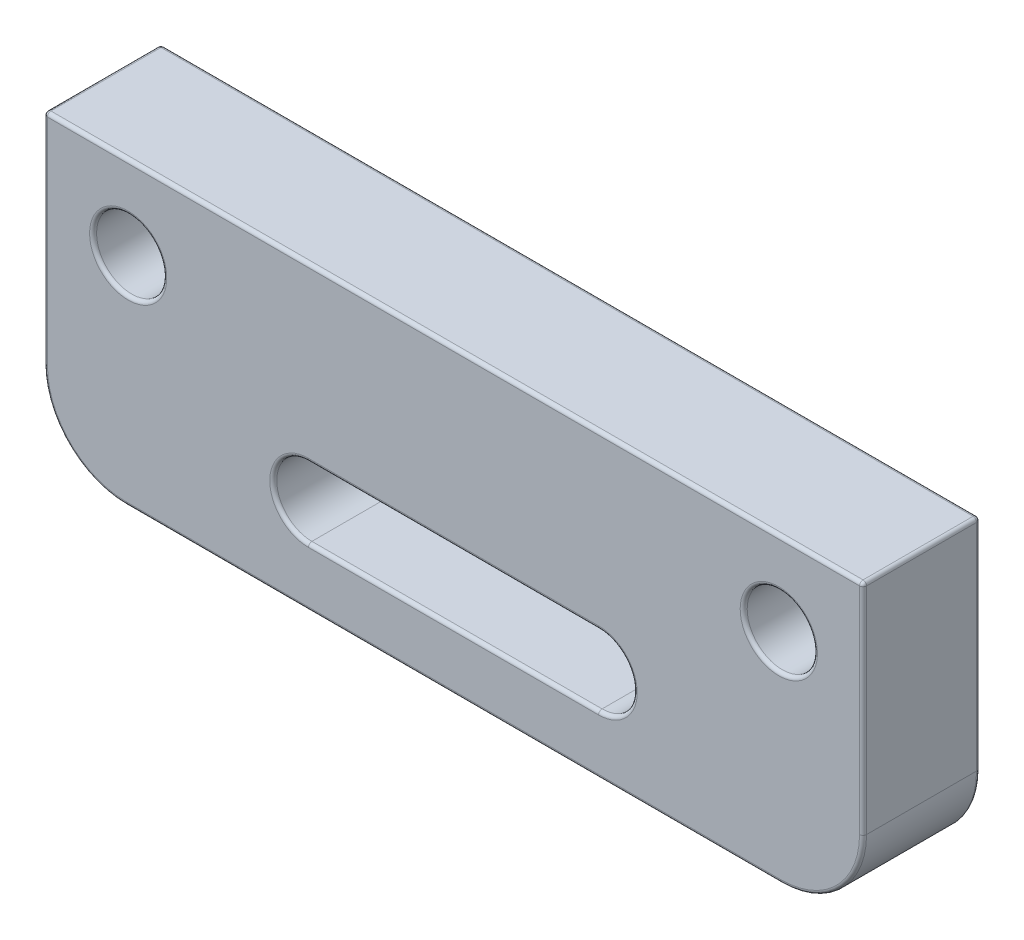
ISO-10303-21;
HEADER;
FILE_DESCRIPTION(('STEP AP214'),'2;1');
FILE_NAME('part.step','',(''),(''),'','','');
FILE_SCHEMA(('AUTOMOTIVE_DESIGN { 1 0 10303 214 1 1 1 1 }'));
ENDSEC;
DATA;
#1=APPLICATION_CONTEXT('core data for automotive mechanical design processes');
#2=APPLICATION_PROTOCOL_DEFINITION('international standard','automotive_design',2000,#1);
#3=PRODUCT_CONTEXT('',#1,'mechanical');
#4=PRODUCT('Part','Part','',(#3));
#5=PRODUCT_RELATED_PRODUCT_CATEGORY('part','',(#4));
#6=PRODUCT_DEFINITION_FORMATION('','',#4);
#7=PRODUCT_DEFINITION_CONTEXT('part definition',#1,'design');
#8=PRODUCT_DEFINITION('design','',#6,#7);
#9=PRODUCT_DEFINITION_SHAPE('','',#8);
#10=(LENGTH_UNIT() NAMED_UNIT(*) SI_UNIT(.MILLI.,.METRE.));
#11=(NAMED_UNIT(*) PLANE_ANGLE_UNIT() SI_UNIT($,.RADIAN.));
#12=(NAMED_UNIT(*) SI_UNIT($,.STERADIAN.) SOLID_ANGLE_UNIT());
#13=UNCERTAINTY_MEASURE_WITH_UNIT(LENGTH_MEASURE(1.E-05),#10,'distance_accuracy_value','');
#14=(GEOMETRIC_REPRESENTATION_CONTEXT(3) GLOBAL_UNCERTAINTY_ASSIGNED_CONTEXT((#13)) GLOBAL_UNIT_ASSIGNED_CONTEXT((#10,
#11,#12)) REPRESENTATION_CONTEXT('',''));
#15=CARTESIAN_POINT('',(0.,0.,0.));
#16=DIRECTION('',(0.,0.,1.));
#17=DIRECTION('',(1.,0.,0.));
#18=AXIS2_PLACEMENT_3D('',#15,#16,#17);
#19=CARTESIAN_POINT('',(-22.35,-6.45,76.5345196391225));
#20=DIRECTION('',(0.,1.,0.));
#21=DIRECTION('',(0.,0.,1.));
#22=AXIS2_PLACEMENT_3D('',#19,#20,#21);
#23=PLANE('',#22);
#24=DIRECTION('',(1.,0.,0.));
#25=VECTOR('',#24,1.);
#26=CARTESIAN_POINT('',(-22.35,-6.45,0.149999999999997));
#27=LINE('',#26,#25);
#28=CARTESIAN_POINT('',(17.35,-6.45,0.15));
#29=VERTEX_POINT('',#28);
#30=CARTESIAN_POINT('',(-17.35,-6.45,0.15));
#31=VERTEX_POINT('',#30);
#32=EDGE_CURVE('E248',#29,#31,#27,.F.);
#33=ORIENTED_EDGE('',*,*,#32,.T.);
#34=DIRECTION('',(0.,0.,1.));
#35=VECTOR('',#34,1.);
#36=CARTESIAN_POINT('',(-17.35,-6.45,4.85000000000001));
#37=LINE('',#36,#35);
#38=CARTESIAN_POINT('',(-17.35,-6.45,4.85));
#39=VERTEX_POINT('',#38);
#40=EDGE_CURVE('E250',#31,#39,#37,.T.);
#41=ORIENTED_EDGE('',*,*,#40,.T.);
#42=DIRECTION('',(-1.,0.,0.));
#43=VECTOR('',#42,1.);
#44=CARTESIAN_POINT('',(17.35,-6.45,4.85));
#45=LINE('',#44,#43);
#46=CARTESIAN_POINT('',(17.35,-6.45,4.85));
#47=VERTEX_POINT('',#46);
#48=EDGE_CURVE('E243',#39,#47,#45,.F.);
#49=ORIENTED_EDGE('',*,*,#48,.T.);
#50=DIRECTION('',(0.,0.,-1.));
#51=VECTOR('',#50,1.);
#52=CARTESIAN_POINT('',(17.35,-6.45,0.149999999999997));
#53=LINE('',#52,#51);
#54=EDGE_CURVE('E245',#47,#29,#53,.T.);
#55=ORIENTED_EDGE('',*,*,#54,.T.);
#56=EDGE_LOOP('',(#33,#41,#49,#55));
#57=FACE_BOUND('',#56,.T.);
#58=ADVANCED_FACE('F35',(#57),#23,.T.);
#59=CARTESIAN_POINT('',(0.,8.19264705882352,5.));
#60=DIRECTION('',(0.,0.,-1.));
#61=DIRECTION('',(-1.,0.,0.));
#62=AXIS2_PLACEMENT_3D('',#59,#60,#61);
#63=PLANE('',#62);
#64=CARTESIAN_POINT('',(-13.9,-10.,5.));
#65=DIRECTION('',(0.,0.,-1.));
#66=DIRECTION('',(-1.,0.,0.));
#67=AXIS2_PLACEMENT_3D('',#64,#65,#66);
#68=CIRCLE('',#67,1.65);
#69=CARTESIAN_POINT('',(-15.55,-10.,5.));
#70=VERTEX_POINT('',#69);
#71=EDGE_CURVE('E304',#70,#70,#68,.T.);
#72=ORIENTED_EDGE('',*,*,#71,.T.);
#73=EDGE_LOOP('',(#72));
#74=FACE_BOUND('',#73,.T.);
#75=CARTESIAN_POINT('',(6.2,-15.3,5.));
#76=DIRECTION('',(0.,0.,-1.));
#77=DIRECTION('',(-1.,0.,0.));
#78=AXIS2_PLACEMENT_3D('',#75,#76,#77);
#79=CIRCLE('',#78,1.65);
#80=CARTESIAN_POINT('',(6.2,-13.65,5.));
#81=VERTEX_POINT('',#80);
#82=CARTESIAN_POINT('',(6.2,-16.95,5.));
#83=VERTEX_POINT('',#82);
#84=EDGE_CURVE('E327',#81,#83,#79,.T.);
#85=ORIENTED_EDGE('',*,*,#84,.T.);
#86=DIRECTION('',(1.,0.,0.));
#87=VECTOR('',#86,1.);
#88=CARTESIAN_POINT('',(-6.19999999999999,-16.95,5.));
#89=LINE('',#88,#87);
#90=CARTESIAN_POINT('',(-6.19999999999999,-16.95,5.));
#91=VERTEX_POINT('',#90);
#92=EDGE_CURVE('E329',#83,#91,#89,.F.);
#93=ORIENTED_EDGE('',*,*,#92,.T.);
#94=CARTESIAN_POINT('',(-6.19999999999999,-15.3,5.));
#95=DIRECTION('',(0.,0.,-1.));
#96=DIRECTION('',(-1.,0.,0.));
#97=AXIS2_PLACEMENT_3D('',#94,#95,#96);
#98=CIRCLE('',#97,1.65);
#99=CARTESIAN_POINT('',(-6.19999999999999,-13.65,5.));
#100=VERTEX_POINT('',#99);
#101=EDGE_CURVE('E323',#91,#100,#98,.T.);
#102=ORIENTED_EDGE('',*,*,#101,.T.);
#103=DIRECTION('',(-1.,0.,0.));
#104=VECTOR('',#103,1.);
#105=CARTESIAN_POINT('',(6.2,-13.65,5.));
#106=LINE('',#105,#104);
#107=EDGE_CURVE('E325',#100,#81,#106,.F.);
#108=ORIENTED_EDGE('',*,*,#107,.T.);
#109=EDGE_LOOP('',(#85,#93,#102,#108));
#110=FACE_BOUND('',#109,.T.);
#111=CARTESIAN_POINT('',(13.9,-10.,5.));
#112=DIRECTION('',(0.,0.,-1.));
#113=DIRECTION('',(-1.,0.,0.));
#114=AXIS2_PLACEMENT_3D('',#111,#112,#113);
#115=CIRCLE('',#114,1.65);
#116=CARTESIAN_POINT('',(12.25,-10.,5.));
#117=VERTEX_POINT('',#116);
#118=EDGE_CURVE('E246',#117,#117,#115,.T.);
#119=ORIENTED_EDGE('',*,*,#118,.T.);
#120=EDGE_LOOP('',(#119));
#121=FACE_BOUND('',#120,.T.);
#122=DIRECTION('',(0.,1.,0.));
#123=VECTOR('',#122,1.);
#124=CARTESIAN_POINT('',(17.35,8.19264705882353,5.));
#125=LINE('',#124,#123);
#126=CARTESIAN_POINT('',(17.35,-15.8,5.));
#127=VERTEX_POINT('',#126);
#128=CARTESIAN_POINT('',(17.35,-6.6,5.));
#129=VERTEX_POINT('',#128);
#130=EDGE_CURVE('E316',#127,#129,#125,.T.);
#131=ORIENTED_EDGE('',*,*,#130,.T.);
#132=DIRECTION('',(-1.,0.,0.));
#133=VECTOR('',#132,1.);
#134=CARTESIAN_POINT('',(-17.35,-6.6,5.));
#135=LINE('',#134,#133);
#136=CARTESIAN_POINT('',(-17.35,-6.6,5.));
#137=VERTEX_POINT('',#136);
#138=EDGE_CURVE('E44',#129,#137,#135,.T.);
#139=ORIENTED_EDGE('',*,*,#138,.T.);
#140=DIRECTION('',(0.,-1.,0.));
#141=VECTOR('',#140,1.);
#142=CARTESIAN_POINT('',(-17.35,8.19264705882352,5.));
#143=LINE('',#142,#141);
#144=CARTESIAN_POINT('',(-17.35,-15.8,5.));
#145=VERTEX_POINT('',#144);
#146=EDGE_CURVE('E318',#137,#145,#143,.T.);
#147=ORIENTED_EDGE('',*,*,#146,.T.);
#148=CARTESIAN_POINT('',(-14.,-15.8,5.));
#149=DIRECTION('',(0.,0.,-1.));
#150=DIRECTION('',(-1.,0.,0.));
#151=AXIS2_PLACEMENT_3D('',#148,#149,#150);
#152=CIRCLE('',#151,3.35);
#153=CARTESIAN_POINT('',(-14.,-19.15,5.));
#154=VERTEX_POINT('',#153);
#155=EDGE_CURVE('E320',#145,#154,#152,.F.);
#156=ORIENTED_EDGE('',*,*,#155,.T.);
#157=DIRECTION('',(1.,0.,0.));
#158=VECTOR('',#157,1.);
#159=CARTESIAN_POINT('',(0.,-19.15,5.));
#160=LINE('',#159,#158);
#161=CARTESIAN_POINT('',(14.,-19.15,5.));
#162=VERTEX_POINT('',#161);
#163=EDGE_CURVE('E312',#154,#162,#160,.T.);
#164=ORIENTED_EDGE('',*,*,#163,.T.);
#165=CARTESIAN_POINT('',(14.,-15.8,5.));
#166=DIRECTION('',(0.,0.,-1.));
#167=DIRECTION('',(-1.,0.,0.));
#168=AXIS2_PLACEMENT_3D('',#165,#166,#167);
#169=CIRCLE('',#168,3.35);
#170=EDGE_CURVE('E314',#162,#127,#169,.F.);
#171=ORIENTED_EDGE('',*,*,#170,.T.);
#172=EDGE_LOOP('',(#131,#139,#147,#156,#164,#171));
#173=FACE_BOUND('',#172,.T.);
#174=ADVANCED_FACE('F500',(#74,#110,#121,#173),#63,.F.);
#175=CARTESIAN_POINT('',(0.,8.19264705882352,0.));
#176=DIRECTION('',(0.,0.,-1.));
#177=DIRECTION('',(-1.,0.,0.));
#178=AXIS2_PLACEMENT_3D('',#175,#176,#177);
#179=PLANE('',#178);
#180=CARTESIAN_POINT('',(-13.9,-10.,0.));
#181=DIRECTION('',(0.,0.,-1.));
#182=DIRECTION('',(-1.,0.,0.));
#183=AXIS2_PLACEMENT_3D('',#180,#181,#182);
#184=CIRCLE('',#183,1.65);
#185=CARTESIAN_POINT('',(-15.55,-10.,0.));
#186=VERTEX_POINT('',#185);
#187=EDGE_CURVE('E376',#186,#186,#184,.F.);
#188=ORIENTED_EDGE('',*,*,#187,.T.);
#189=EDGE_LOOP('',(#188));
#190=FACE_BOUND('',#189,.T.);
#191=DIRECTION('',(1.,0.,0.));
#192=VECTOR('',#191,1.);
#193=CARTESIAN_POINT('',(0.,-16.95,0.));
#194=LINE('',#193,#192);
#195=CARTESIAN_POINT('',(-6.19999999999999,-16.95,0.));
#196=VERTEX_POINT('',#195);
#197=CARTESIAN_POINT('',(6.2,-16.95,0.));
#198=VERTEX_POINT('',#197);
#199=EDGE_CURVE('E383',#196,#198,#194,.T.);
#200=ORIENTED_EDGE('',*,*,#199,.T.);
#201=CARTESIAN_POINT('',(6.2,-15.3,0.));
#202=DIRECTION('',(0.,0.,-1.));
#203=DIRECTION('',(-1.,0.,0.));
#204=AXIS2_PLACEMENT_3D('',#201,#202,#203);
#205=CIRCLE('',#204,1.65);
#206=CARTESIAN_POINT('',(6.2,-13.65,0.));
#207=VERTEX_POINT('',#206);
#208=EDGE_CURVE('E385',#198,#207,#205,.F.);
#209=ORIENTED_EDGE('',*,*,#208,.T.);
#210=DIRECTION('',(-1.,0.,0.));
#211=VECTOR('',#210,1.);
#212=CARTESIAN_POINT('',(0.,-13.65,0.));
#213=LINE('',#212,#211);
#214=CARTESIAN_POINT('',(-6.19999999999999,-13.65,0.));
#215=VERTEX_POINT('',#214);
#216=EDGE_CURVE('E379',#207,#215,#213,.T.);
#217=ORIENTED_EDGE('',*,*,#216,.T.);
#218=CARTESIAN_POINT('',(-6.19999999999999,-15.3,0.));
#219=DIRECTION('',(0.,0.,-1.));
#220=DIRECTION('',(-1.,0.,0.));
#221=AXIS2_PLACEMENT_3D('',#218,#219,#220);
#222=CIRCLE('',#221,1.65);
#223=EDGE_CURVE('E381',#215,#196,#222,.F.);
#224=ORIENTED_EDGE('',*,*,#223,.T.);
#225=EDGE_LOOP('',(#200,#209,#217,#224));
#226=FACE_BOUND('',#225,.T.);
#227=CARTESIAN_POINT('',(13.9,-10.,0.));
#228=DIRECTION('',(0.,0.,-1.));
#229=DIRECTION('',(-1.,0.,0.));
#230=AXIS2_PLACEMENT_3D('',#227,#228,#229);
#231=CIRCLE('',#230,1.65);
#232=CARTESIAN_POINT('',(12.25,-10.,0.));
#233=VERTEX_POINT('',#232);
#234=EDGE_CURVE('E388',#233,#233,#231,.F.);
#235=ORIENTED_EDGE('',*,*,#234,.T.);
#236=EDGE_LOOP('',(#235));
#237=FACE_BOUND('',#236,.T.);
#238=DIRECTION('',(0.,-1.,0.));
#239=VECTOR('',#238,1.);
#240=CARTESIAN_POINT('',(-17.35,8.7,0.));
#241=LINE('',#240,#239);
#242=CARTESIAN_POINT('',(-17.35,-15.8,0.));
#243=VERTEX_POINT('',#242);
#244=CARTESIAN_POINT('',(-17.35,-6.6,0.));
#245=VERTEX_POINT('',#244);
#246=EDGE_CURVE('E374',#243,#245,#241,.F.);
#247=ORIENTED_EDGE('',*,*,#246,.T.);
#248=DIRECTION('',(1.,0.,0.));
#249=VECTOR('',#248,1.);
#250=CARTESIAN_POINT('',(0.,-6.6,0.));
#251=LINE('',#250,#249);
#252=CARTESIAN_POINT('',(17.35,-6.6,0.));
#253=VERTEX_POINT('',#252);
#254=EDGE_CURVE('E192',#245,#253,#251,.T.);
#255=ORIENTED_EDGE('',*,*,#254,.T.);
#256=DIRECTION('',(0.,1.,0.));
#257=VECTOR('',#256,1.);
#258=CARTESIAN_POINT('',(17.35,-15.8,0.));
#259=LINE('',#258,#257);
#260=CARTESIAN_POINT('',(17.35,-15.8,0.));
#261=VERTEX_POINT('',#260);
#262=EDGE_CURVE('E185',#253,#261,#259,.F.);
#263=ORIENTED_EDGE('',*,*,#262,.T.);
#264=CARTESIAN_POINT('',(14.,-15.8,0.));
#265=DIRECTION('',(0.,0.,-1.));
#266=DIRECTION('',(-1.,0.,0.));
#267=AXIS2_PLACEMENT_3D('',#264,#265,#266);
#268=CIRCLE('',#267,3.35);
#269=CARTESIAN_POINT('',(14.,-19.15,0.));
#270=VERTEX_POINT('',#269);
#271=EDGE_CURVE('E189',#261,#270,#268,.T.);
#272=ORIENTED_EDGE('',*,*,#271,.T.);
#273=DIRECTION('',(1.,0.,0.));
#274=VECTOR('',#273,1.);
#275=CARTESIAN_POINT('',(-14.,-19.15,0.));
#276=LINE('',#275,#274);
#277=CARTESIAN_POINT('',(-14.,-19.15,0.));
#278=VERTEX_POINT('',#277);
#279=EDGE_CURVE('E207',#270,#278,#276,.F.);
#280=ORIENTED_EDGE('',*,*,#279,.T.);
#281=CARTESIAN_POINT('',(-14.,-15.8,0.));
#282=DIRECTION('',(0.,0.,-1.));
#283=DIRECTION('',(-1.,0.,0.));
#284=AXIS2_PLACEMENT_3D('',#281,#282,#283);
#285=CIRCLE('',#284,3.35);
#286=EDGE_CURVE('E372',#278,#243,#285,.T.);
#287=ORIENTED_EDGE('',*,*,#286,.T.);
#288=EDGE_LOOP('',(#247,#255,#263,#272,#280,#287));
#289=FACE_BOUND('',#288,.T.);
#290=ADVANCED_FACE('F188',(#190,#226,#237,#289),#179,.T.);
#291=CARTESIAN_POINT('',(-17.5,8.7,5.));
#292=DIRECTION('',(1.,0.,0.));
#293=DIRECTION('',(0.,1.,0.));
#294=AXIS2_PLACEMENT_3D('',#291,#292,#293);
#295=PLANE('',#294);
#296=DIRECTION('',(0.,-1.,0.));
#297=VECTOR('',#296,1.);
#298=CARTESIAN_POINT('',(-17.5,8.7,4.85));
#299=LINE('',#298,#297);
#300=CARTESIAN_POINT('',(-17.5,-15.8,4.85));
#301=VERTEX_POINT('',#300);
#302=CARTESIAN_POINT('',(-17.5,-6.6,4.85));
#303=VERTEX_POINT('',#302);
#304=EDGE_CURVE('E421',#301,#303,#299,.F.);
#305=ORIENTED_EDGE('',*,*,#304,.T.);
#306=DIRECTION('',(0.,0.,1.));
#307=VECTOR('',#306,1.);
#308=CARTESIAN_POINT('',(-17.5,-6.6,0.149999999999997));
#309=LINE('',#308,#307);
#310=CARTESIAN_POINT('',(-17.5,-6.6,0.15));
#311=VERTEX_POINT('',#310);
#312=EDGE_CURVE('E253',#303,#311,#309,.F.);
#313=ORIENTED_EDGE('',*,*,#312,.T.);
#314=DIRECTION('',(0.,-1.,0.));
#315=VECTOR('',#314,1.);
#316=CARTESIAN_POINT('',(-17.5,-15.8,0.15));
#317=LINE('',#316,#315);
#318=CARTESIAN_POINT('',(-17.5,-15.8,0.15));
#319=VERTEX_POINT('',#318);
#320=EDGE_CURVE('E424',#311,#319,#317,.T.);
#321=ORIENTED_EDGE('',*,*,#320,.T.);
#322=DIRECTION('',(0.,0.,-1.));
#323=VECTOR('',#322,1.);
#324=CARTESIAN_POINT('',(-17.5,-15.8,5.));
#325=LINE('',#324,#323);
#326=EDGE_CURVE('E196',#319,#301,#325,.F.);
#327=ORIENTED_EDGE('',*,*,#326,.T.);
#328=EDGE_LOOP('',(#305,#313,#321,#327));
#329=FACE_BOUND('',#328,.T.);
#330=ADVANCED_FACE('F461',(#329),#295,.F.);
#331=CARTESIAN_POINT('',(17.5,8.70000000000001,5.));
#332=DIRECTION('',(-1.,0.,0.));
#333=DIRECTION('',(0.,-1.,0.));
#334=AXIS2_PLACEMENT_3D('',#331,#332,#333);
#335=PLANE('',#334);
#336=DIRECTION('',(0.,1.,0.));
#337=VECTOR('',#336,1.);
#338=CARTESIAN_POINT('',(17.5,8.70000000000001,0.15));
#339=LINE('',#338,#337);
#340=CARTESIAN_POINT('',(17.5,-15.8,0.15));
#341=VERTEX_POINT('',#340);
#342=CARTESIAN_POINT('',(17.5,-6.6,0.15));
#343=VERTEX_POINT('',#342);
#344=EDGE_CURVE('E211',#341,#343,#339,.T.);
#345=ORIENTED_EDGE('',*,*,#344,.T.);
#346=DIRECTION('',(0.,0.,-1.));
#347=VECTOR('',#346,1.);
#348=CARTESIAN_POINT('',(17.5,-6.6,4.85000000000001));
#349=LINE('',#348,#347);
#350=CARTESIAN_POINT('',(17.5,-6.6,4.85));
#351=VERTEX_POINT('',#350);
#352=EDGE_CURVE('E261',#343,#351,#349,.F.);
#353=ORIENTED_EDGE('',*,*,#352,.T.);
#354=DIRECTION('',(0.,1.,0.));
#355=VECTOR('',#354,1.);
#356=CARTESIAN_POINT('',(17.5,8.70000000000001,4.85));
#357=LINE('',#356,#355);
#358=CARTESIAN_POINT('',(17.5,-15.8,4.85));
#359=VERTEX_POINT('',#358);
#360=EDGE_CURVE('E297',#351,#359,#357,.F.);
#361=ORIENTED_EDGE('',*,*,#360,.T.);
#362=DIRECTION('',(0.,0.,-1.));
#363=VECTOR('',#362,1.);
#364=CARTESIAN_POINT('',(17.5,-15.8,5.));
#365=LINE('',#364,#363);
#366=EDGE_CURVE('E361',#359,#341,#365,.T.);
#367=ORIENTED_EDGE('',*,*,#366,.T.);
#368=EDGE_LOOP('',(#345,#353,#361,#367));
#369=FACE_BOUND('',#368,.T.);
#370=ADVANCED_FACE('F295',(#369),#335,.F.);
#371=CARTESIAN_POINT('',(17.35,8.70000000000001,0.15));
#372=DIRECTION('',(0.,-1.,0.));
#373=DIRECTION('',(1.,0.,0.));
#374=AXIS2_PLACEMENT_3D('',#371,#372,#373);
#375=CYLINDRICAL_SURFACE('',#374,0.15);
#376=ORIENTED_EDGE('',*,*,#262,.F.);
#377=CARTESIAN_POINT('',(17.35,-6.6,0.15));
#378=DIRECTION('',(0.,-1.,0.));
#379=DIRECTION('',(1.,0.,0.));
#380=AXIS2_PLACEMENT_3D('',#377,#378,#379);
#381=CIRCLE('',#380,0.15);
#382=EDGE_CURVE('E259',#253,#343,#381,.T.);
#383=ORIENTED_EDGE('',*,*,#382,.T.);
#384=ORIENTED_EDGE('',*,*,#344,.F.);
#385=CARTESIAN_POINT('',(17.35,-15.8,0.15));
#386=DIRECTION('',(0.,1.,0.));
#387=DIRECTION('',(0.,0.,1.));
#388=AXIS2_PLACEMENT_3D('',#385,#386,#387);
#389=CIRCLE('',#388,0.15);
#390=EDGE_CURVE('E203',#341,#261,#389,.T.);
#391=ORIENTED_EDGE('',*,*,#390,.T.);
#392=EDGE_LOOP('',(#376,#383,#384,#391));
#393=FACE_BOUND('',#392,.T.);
#394=ADVANCED_FACE('F209',(#393),#375,.T.);
#395=CARTESIAN_POINT('',(-17.35,8.7,0.15));
#396=DIRECTION('',(0.,1.,0.));
#397=DIRECTION('',(-1.,0.,0.));
#398=AXIS2_PLACEMENT_3D('',#395,#396,#397);
#399=CYLINDRICAL_SURFACE('',#398,0.15);
#400=ORIENTED_EDGE('',*,*,#320,.F.);
#401=CARTESIAN_POINT('',(-17.35,-6.6,0.15));
#402=DIRECTION('',(0.,1.,0.));
#403=DIRECTION('',(-1.,0.,0.));
#404=AXIS2_PLACEMENT_3D('',#401,#402,#403);
#405=CIRCLE('',#404,0.15);
#406=EDGE_CURVE('E256',#311,#245,#405,.F.);
#407=ORIENTED_EDGE('',*,*,#406,.T.);
#408=ORIENTED_EDGE('',*,*,#246,.F.);
#409=CARTESIAN_POINT('',(-17.35,-15.8,0.15));
#410=DIRECTION('',(0.,1.,0.));
#411=DIRECTION('',(0.,0.,1.));
#412=AXIS2_PLACEMENT_3D('',#409,#410,#411);
#413=CIRCLE('',#412,0.15);
#414=EDGE_CURVE('E213',#243,#319,#413,.T.);
#415=ORIENTED_EDGE('',*,*,#414,.T.);
#416=EDGE_LOOP('',(#400,#407,#408,#415));
#417=FACE_BOUND('',#416,.T.);
#418=ADVANCED_FACE('F465',(#417),#399,.T.);
#419=CARTESIAN_POINT('',(17.35,8.19264705882353,4.85));
#420=DIRECTION('',(0.,1.,0.));
#421=DIRECTION('',(-1.,0.,0.));
#422=AXIS2_PLACEMENT_3D('',#419,#420,#421);
#423=CYLINDRICAL_SURFACE('',#422,0.15);
#424=ORIENTED_EDGE('',*,*,#360,.F.);
#425=CARTESIAN_POINT('',(17.35,-6.6,4.85));
#426=DIRECTION('',(0.,1.,0.));
#427=DIRECTION('',(-1.,0.,0.));
#428=AXIS2_PLACEMENT_3D('',#425,#426,#427);
#429=CIRCLE('',#428,0.15);
#430=EDGE_CURVE('E59',#351,#129,#429,.F.);
#431=ORIENTED_EDGE('',*,*,#430,.T.);
#432=ORIENTED_EDGE('',*,*,#130,.F.);
#433=CARTESIAN_POINT('',(17.35,-15.8,4.85));
#434=DIRECTION('',(0.,-1.,0.));
#435=DIRECTION('',(0.,0.,-1.));
#436=AXIS2_PLACEMENT_3D('',#433,#434,#435);
#437=CIRCLE('',#436,0.15);
#438=EDGE_CURVE('E227',#359,#127,#437,.T.);
#439=ORIENTED_EDGE('',*,*,#438,.F.);
#440=EDGE_LOOP('',(#424,#431,#432,#439));
#441=FACE_BOUND('',#440,.T.);
#442=ADVANCED_FACE('F300',(#441),#423,.T.);
#443=CARTESIAN_POINT('',(-17.35,8.19264705882352,4.85));
#444=DIRECTION('',(0.,-1.,0.));
#445=DIRECTION('',(1.,0.,0.));
#446=AXIS2_PLACEMENT_3D('',#443,#444,#445);
#447=CYLINDRICAL_SURFACE('',#446,0.15);
#448=ORIENTED_EDGE('',*,*,#146,.F.);
#449=CARTESIAN_POINT('',(-17.35,-6.6,4.85));
#450=DIRECTION('',(0.,-1.,0.));
#451=DIRECTION('',(1.,0.,0.));
#452=AXIS2_PLACEMENT_3D('',#449,#450,#451);
#453=CIRCLE('',#452,0.15);
#454=EDGE_CURVE('E11',#137,#303,#453,.T.);
#455=ORIENTED_EDGE('',*,*,#454,.T.);
#456=ORIENTED_EDGE('',*,*,#304,.F.);
#457=CARTESIAN_POINT('',(-17.35,-15.8,4.85));
#458=DIRECTION('',(0.,-1.,0.));
#459=DIRECTION('',(0.,0.,-1.));
#460=AXIS2_PLACEMENT_3D('',#457,#458,#459);
#461=CIRCLE('',#460,0.15);
#462=EDGE_CURVE('E236',#145,#301,#461,.T.);
#463=ORIENTED_EDGE('',*,*,#462,.F.);
#464=EDGE_LOOP('',(#448,#455,#456,#463));
#465=FACE_BOUND('',#464,.T.);
#466=ADVANCED_FACE('F538',(#465),#447,.T.);
#467=CARTESIAN_POINT('',(-17.5,-19.3,5.));
#468=DIRECTION('',(0.,1.,0.));
#469=DIRECTION('',(-1.,0.,0.));
#470=AXIS2_PLACEMENT_3D('',#467,#468,#469);
#471=PLANE('',#470);
#472=DIRECTION('',(0.,0.,-1.));
#473=VECTOR('',#472,1.);
#474=CARTESIAN_POINT('',(-14.,-19.3,5.));
#475=LINE('',#474,#473);
#476=CARTESIAN_POINT('',(-14.,-19.3,4.85));
#477=VERTEX_POINT('',#476);
#478=CARTESIAN_POINT('',(-14.,-19.3,0.15));
#479=VERTEX_POINT('',#478);
#480=EDGE_CURVE('E363',#477,#479,#475,.T.);
#481=ORIENTED_EDGE('',*,*,#480,.T.);
#482=DIRECTION('',(1.,0.,0.));
#483=VECTOR('',#482,1.);
#484=CARTESIAN_POINT('',(14.,-19.3,0.15));
#485=LINE('',#484,#483);
#486=CARTESIAN_POINT('',(14.,-19.3,0.15));
#487=VERTEX_POINT('',#486);
#488=EDGE_CURVE('E433',#479,#487,#485,.T.);
#489=ORIENTED_EDGE('',*,*,#488,.T.);
#490=DIRECTION('',(0.,0.,-1.));
#491=VECTOR('',#490,1.);
#492=CARTESIAN_POINT('',(14.,-19.3,5.));
#493=LINE('',#492,#491);
#494=CARTESIAN_POINT('',(14.,-19.3,4.85));
#495=VERTEX_POINT('',#494);
#496=EDGE_CURVE('E366',#487,#495,#493,.F.);
#497=ORIENTED_EDGE('',*,*,#496,.T.);
#498=DIRECTION('',(1.,0.,0.));
#499=VECTOR('',#498,1.);
#500=CARTESIAN_POINT('',(-17.5,-19.3,4.85));
#501=LINE('',#500,#499);
#502=EDGE_CURVE('E431',#495,#477,#501,.F.);
#503=ORIENTED_EDGE('',*,*,#502,.T.);
#504=EDGE_LOOP('',(#481,#489,#497,#503));
#505=FACE_BOUND('',#504,.T.);
#506=ADVANCED_FACE('F440',(#505),#471,.F.);
#507=CARTESIAN_POINT('',(-13.9,-10.,5.));
#508=DIRECTION('',(0.,0.,-1.));
#509=DIRECTION('',(-1.,0.,0.));
#510=AXIS2_PLACEMENT_3D('',#507,#508,#509);
#511=CYLINDRICAL_SURFACE('',#510,1.5);
#512=CARTESIAN_POINT('',(-13.9,-10.,0.15));
#513=DIRECTION('',(0.,0.,-1.));
#514=DIRECTION('',(-1.,0.,0.));
#515=AXIS2_PLACEMENT_3D('',#512,#513,#514);
#516=CIRCLE('',#515,1.5);
#517=CARTESIAN_POINT('',(-15.4,-10.,0.15));
#518=VERTEX_POINT('',#517);
#519=EDGE_CURVE('E418',#518,#518,#516,.T.);
#520=ORIENTED_EDGE('',*,*,#519,.T.);
#521=EDGE_LOOP('',(#520));
#522=FACE_BOUND('',#521,.T.);
#523=CARTESIAN_POINT('',(-13.9,-10.,4.85));
#524=DIRECTION('',(0.,0.,-1.));
#525=DIRECTION('',(-1.,0.,0.));
#526=AXIS2_PLACEMENT_3D('',#523,#524,#525);
#527=CIRCLE('',#526,1.5);
#528=CARTESIAN_POINT('',(-15.4,-10.,4.85));
#529=VERTEX_POINT('',#528);
#530=EDGE_CURVE('E415',#529,#529,#527,.F.);
#531=ORIENTED_EDGE('',*,*,#530,.T.);
#532=EDGE_LOOP('',(#531));
#533=FACE_BOUND('',#532,.T.);
#534=ADVANCED_FACE('F526',(#522,#533),#511,.F.);
#535=CARTESIAN_POINT('',(-6.19999999999999,-15.3,5.));
#536=DIRECTION('',(0.,0.,-1.));
#537=DIRECTION('',(-1.,0.,0.));
#538=AXIS2_PLACEMENT_3D('',#535,#536,#537);
#539=CYLINDRICAL_SURFACE('',#538,1.5);
#540=DIRECTION('',(0.,0.,-1.));
#541=VECTOR('',#540,1.);
#542=CARTESIAN_POINT('',(-6.19999999999999,-16.8,5.));
#543=LINE('',#542,#541);
#544=CARTESIAN_POINT('',(-6.19999999999999,-16.8,4.85));
#545=VERTEX_POINT('',#544);
#546=CARTESIAN_POINT('',(-6.19999999999999,-16.8,0.15));
#547=VERTEX_POINT('',#546);
#548=EDGE_CURVE('E358',#545,#547,#543,.T.);
#549=ORIENTED_EDGE('',*,*,#548,.T.);
#550=CARTESIAN_POINT('',(-6.19999999999999,-15.3,0.15));
#551=DIRECTION('',(0.,0.,-1.));
#552=DIRECTION('',(-1.,0.,0.));
#553=AXIS2_PLACEMENT_3D('',#550,#551,#552);
#554=CIRCLE('',#553,1.5);
#555=CARTESIAN_POINT('',(-6.19999999999999,-13.8,0.15));
#556=VERTEX_POINT('',#555);
#557=EDGE_CURVE('E409',#547,#556,#554,.T.);
#558=ORIENTED_EDGE('',*,*,#557,.T.);
#559=DIRECTION('',(0.,0.,-1.));
#560=VECTOR('',#559,1.);
#561=CARTESIAN_POINT('',(-6.19999999999999,-13.8,5.));
#562=LINE('',#561,#560);
#563=CARTESIAN_POINT('',(-6.19999999999999,-13.8,4.85));
#564=VERTEX_POINT('',#563);
#565=EDGE_CURVE('E341',#564,#556,#562,.T.);
#566=ORIENTED_EDGE('',*,*,#565,.F.);
#567=CARTESIAN_POINT('',(-6.19999999999999,-15.3,4.85));
#568=DIRECTION('',(0.,0.,-1.));
#569=DIRECTION('',(-1.,0.,0.));
#570=AXIS2_PLACEMENT_3D('',#567,#568,#569);
#571=CIRCLE('',#570,1.5);
#572=EDGE_CURVE('E407',#564,#545,#571,.F.);
#573=ORIENTED_EDGE('',*,*,#572,.T.);
#574=EDGE_LOOP('',(#549,#558,#566,#573));
#575=FACE_BOUND('',#574,.T.);
#576=ADVANCED_FACE('F522',(#575),#539,.F.);
#577=CARTESIAN_POINT('',(-6.19999999999999,-16.8,5.));
#578=DIRECTION('',(0.,1.,0.));
#579=DIRECTION('',(0.,0.,1.));
#580=AXIS2_PLACEMENT_3D('',#577,#578,#579);
#581=PLANE('',#580);
#582=DIRECTION('',(0.,0.,-1.));
#583=VECTOR('',#582,1.);
#584=CARTESIAN_POINT('',(6.2,-16.8,5.));
#585=LINE('',#584,#583);
#586=CARTESIAN_POINT('',(6.2,-16.8,4.85));
#587=VERTEX_POINT('',#586);
#588=CARTESIAN_POINT('',(6.2,-16.8,0.15));
#589=VERTEX_POINT('',#588);
#590=EDGE_CURVE('E353',#587,#589,#585,.T.);
#591=ORIENTED_EDGE('',*,*,#590,.T.);
#592=DIRECTION('',(1.,0.,0.));
#593=VECTOR('',#592,1.);
#594=CARTESIAN_POINT('',(-6.19999999999999,-16.8,0.15));
#595=LINE('',#594,#593);
#596=EDGE_CURVE('E405',#589,#547,#595,.F.);
#597=ORIENTED_EDGE('',*,*,#596,.T.);
#598=ORIENTED_EDGE('',*,*,#548,.F.);
#599=DIRECTION('',(1.,0.,0.));
#600=VECTOR('',#599,1.);
#601=CARTESIAN_POINT('',(6.2,-16.8,4.85));
#602=LINE('',#601,#600);
#603=EDGE_CURVE('E402',#545,#587,#602,.T.);
#604=ORIENTED_EDGE('',*,*,#603,.T.);
#605=EDGE_LOOP('',(#591,#597,#598,#604));
#606=FACE_BOUND('',#605,.T.);
#607=ADVANCED_FACE('F518',(#606),#581,.T.);
#608=CARTESIAN_POINT('',(6.2,-15.3,5.));
#609=DIRECTION('',(0.,0.,-1.));
#610=DIRECTION('',(-1.,0.,0.));
#611=AXIS2_PLACEMENT_3D('',#608,#609,#610);
#612=CYLINDRICAL_SURFACE('',#611,1.5);
#613=DIRECTION('',(0.,0.,-1.));
#614=VECTOR('',#613,1.);
#615=CARTESIAN_POINT('',(6.2,-13.8,5.));
#616=LINE('',#615,#614);
#617=CARTESIAN_POINT('',(6.2,-13.8,4.85));
#618=VERTEX_POINT('',#617);
#619=CARTESIAN_POINT('',(6.2,-13.8,0.15));
#620=VERTEX_POINT('',#619);
#621=EDGE_CURVE('E347',#618,#620,#616,.T.);
#622=ORIENTED_EDGE('',*,*,#621,.T.);
#623=CARTESIAN_POINT('',(6.2,-15.3,0.15));
#624=DIRECTION('',(0.,0.,-1.));
#625=DIRECTION('',(-1.,0.,0.));
#626=AXIS2_PLACEMENT_3D('',#623,#624,#625);
#627=CIRCLE('',#626,1.5);
#628=EDGE_CURVE('E399',#620,#589,#627,.T.);
#629=ORIENTED_EDGE('',*,*,#628,.T.);
#630=ORIENTED_EDGE('',*,*,#590,.F.);
#631=CARTESIAN_POINT('',(6.2,-15.3,4.85));
#632=DIRECTION('',(0.,0.,-1.));
#633=DIRECTION('',(-1.,0.,0.));
#634=AXIS2_PLACEMENT_3D('',#631,#632,#633);
#635=CIRCLE('',#634,1.5);
#636=EDGE_CURVE('E397',#587,#618,#635,.F.);
#637=ORIENTED_EDGE('',*,*,#636,.T.);
#638=EDGE_LOOP('',(#622,#629,#630,#637));
#639=FACE_BOUND('',#638,.T.);
#640=ADVANCED_FACE('F515',(#639),#612,.F.);
#641=CARTESIAN_POINT('',(-6.19999999999999,-13.8,5.));
#642=DIRECTION('',(0.,-1.,0.));
#643=DIRECTION('',(1.,0.,0.));
#644=AXIS2_PLACEMENT_3D('',#641,#642,#643);
#645=PLANE('',#644);
#646=ORIENTED_EDGE('',*,*,#565,.T.);
#647=DIRECTION('',(-1.,0.,0.));
#648=VECTOR('',#647,1.);
#649=CARTESIAN_POINT('',(-6.19999999999999,-13.8,0.15));
#650=LINE('',#649,#648);
#651=EDGE_CURVE('E413',#556,#620,#650,.F.);
#652=ORIENTED_EDGE('',*,*,#651,.T.);
#653=ORIENTED_EDGE('',*,*,#621,.F.);
#654=DIRECTION('',(-1.,0.,0.));
#655=VECTOR('',#654,1.);
#656=CARTESIAN_POINT('',(-6.19999999999999,-13.8,4.85));
#657=LINE('',#656,#655);
#658=EDGE_CURVE('E411',#618,#564,#657,.T.);
#659=ORIENTED_EDGE('',*,*,#658,.T.);
#660=EDGE_LOOP('',(#646,#652,#653,#659));
#661=FACE_BOUND('',#660,.T.);
#662=ADVANCED_FACE('F511',(#661),#645,.T.);
#663=CARTESIAN_POINT('',(13.9,-10.,5.));
#664=DIRECTION('',(0.,0.,-1.));
#665=DIRECTION('',(-1.,0.,0.));
#666=AXIS2_PLACEMENT_3D('',#663,#664,#665);
#667=CYLINDRICAL_SURFACE('',#666,1.5);
#668=CARTESIAN_POINT('',(13.9,-10.,0.15));
#669=DIRECTION('',(0.,0.,-1.));
#670=DIRECTION('',(-1.,0.,0.));
#671=AXIS2_PLACEMENT_3D('',#668,#669,#670);
#672=CIRCLE('',#671,1.5);
#673=CARTESIAN_POINT('',(12.4,-10.,0.15));
#674=VERTEX_POINT('',#673);
#675=EDGE_CURVE('E394',#674,#674,#672,.T.);
#676=ORIENTED_EDGE('',*,*,#675,.T.);
#677=EDGE_LOOP('',(#676));
#678=FACE_BOUND('',#677,.T.);
#679=CARTESIAN_POINT('',(13.9,-10.,4.85));
#680=DIRECTION('',(0.,0.,-1.));
#681=DIRECTION('',(-1.,0.,0.));
#682=AXIS2_PLACEMENT_3D('',#679,#680,#681);
#683=CIRCLE('',#682,1.5);
#684=CARTESIAN_POINT('',(12.4,-10.,4.85));
#685=VERTEX_POINT('',#684);
#686=EDGE_CURVE('E391',#685,#685,#683,.F.);
#687=ORIENTED_EDGE('',*,*,#686,.T.);
#688=EDGE_LOOP('',(#687));
#689=FACE_BOUND('',#688,.T.);
#690=ADVANCED_FACE('F508',(#678,#689),#667,.F.);
#691=CARTESIAN_POINT('',(14.,-15.8,5.));
#692=DIRECTION('',(0.,0.,-1.));
#693=DIRECTION('',(-1.,0.,0.));
#694=AXIS2_PLACEMENT_3D('',#691,#692,#693);
#695=CYLINDRICAL_SURFACE('',#694,3.5);
#696=ORIENTED_EDGE('',*,*,#496,.F.);
#697=CARTESIAN_POINT('',(14.,-15.8,0.15));
#698=DIRECTION('',(0.,0.,-1.));
#699=DIRECTION('',(-1.,0.,0.));
#700=AXIS2_PLACEMENT_3D('',#697,#698,#699);
#701=CIRCLE('',#700,3.5);
#702=EDGE_CURVE('E302',#487,#341,#701,.F.);
#703=ORIENTED_EDGE('',*,*,#702,.T.);
#704=ORIENTED_EDGE('',*,*,#366,.F.);
#705=CARTESIAN_POINT('',(14.,-15.8,4.85));
#706=DIRECTION('',(0.,0.,-1.));
#707=DIRECTION('',(-1.,0.,0.));
#708=AXIS2_PLACEMENT_3D('',#705,#706,#707);
#709=CIRCLE('',#708,3.5);
#710=EDGE_CURVE('E306',#359,#495,#709,.T.);
#711=ORIENTED_EDGE('',*,*,#710,.T.);
#712=EDGE_LOOP('',(#696,#703,#704,#711));
#713=FACE_BOUND('',#712,.T.);
#714=ADVANCED_FACE('F436',(#713),#695,.T.);
#715=CARTESIAN_POINT('',(-14.,-15.8,5.));
#716=DIRECTION('',(0.,0.,-1.));
#717=DIRECTION('',(-1.,0.,0.));
#718=AXIS2_PLACEMENT_3D('',#715,#716,#717);
#719=CYLINDRICAL_SURFACE('',#718,3.5);
#720=ORIENTED_EDGE('',*,*,#326,.F.);
#721=CARTESIAN_POINT('',(-14.,-15.8,0.15));
#722=DIRECTION('',(0.,0.,-1.));
#723=DIRECTION('',(-1.,0.,0.));
#724=AXIS2_PLACEMENT_3D('',#721,#722,#723);
#725=CIRCLE('',#724,3.5);
#726=EDGE_CURVE('E429',#319,#479,#725,.F.);
#727=ORIENTED_EDGE('',*,*,#726,.T.);
#728=ORIENTED_EDGE('',*,*,#480,.F.);
#729=CARTESIAN_POINT('',(-14.,-15.8,4.85));
#730=DIRECTION('',(0.,0.,-1.));
#731=DIRECTION('',(-1.,0.,0.));
#732=AXIS2_PLACEMENT_3D('',#729,#730,#731);
#733=CIRCLE('',#732,3.5);
#734=EDGE_CURVE('E426',#477,#301,#733,.T.);
#735=ORIENTED_EDGE('',*,*,#734,.T.);
#736=EDGE_LOOP('',(#720,#727,#728,#735));
#737=FACE_BOUND('',#736,.T.);
#738=ADVANCED_FACE('F458',(#737),#719,.T.);
#739=CARTESIAN_POINT('',(13.9,-10.,0.15));
#740=DIRECTION('',(0.,0.,-1.));
#741=DIRECTION('',(-1.,0.,0.));
#742=AXIS2_PLACEMENT_3D('',#739,#740,#741);
#743=TOROIDAL_SURFACE('',#742,1.65,0.15);
#744=ORIENTED_EDGE('',*,*,#675,.F.);
#745=EDGE_LOOP('',(#744));
#746=FACE_BOUND('',#745,.T.);
#747=ORIENTED_EDGE('',*,*,#234,.F.);
#748=EDGE_LOOP('',(#747));
#749=FACE_BOUND('',#748,.T.);
#750=ADVANCED_FACE('F545',(#746,#749),#743,.T.);
#751=CARTESIAN_POINT('',(-6.19999999999999,-15.3,0.15));
#752=DIRECTION('',(0.,0.,-1.));
#753=DIRECTION('',(-1.,0.,0.));
#754=AXIS2_PLACEMENT_3D('',#751,#752,#753);
#755=TOROIDAL_SURFACE('',#754,1.65,0.15);
#756=CARTESIAN_POINT('',(-6.19999999999999,-13.65,0.15));
#757=DIRECTION('',(1.,0.,0.));
#758=DIRECTION('',(0.,0.,-1.));
#759=AXIS2_PLACEMENT_3D('',#756,#757,#758);
#760=CIRCLE('',#759,0.15);
#761=EDGE_CURVE('E337',#556,#215,#760,.T.);
#762=ORIENTED_EDGE('',*,*,#761,.F.);
#763=ORIENTED_EDGE('',*,*,#557,.F.);
#764=CARTESIAN_POINT('',(-6.19999999999999,-16.95,0.15));
#765=DIRECTION('',(1.,0.,0.));
#766=DIRECTION('',(0.,0.,-1.));
#767=AXIS2_PLACEMENT_3D('',#764,#765,#766);
#768=CIRCLE('',#767,0.15);
#769=EDGE_CURVE('E339',#196,#547,#768,.T.);
#770=ORIENTED_EDGE('',*,*,#769,.F.);
#771=ORIENTED_EDGE('',*,*,#223,.F.);
#772=EDGE_LOOP('',(#762,#763,#770,#771));
#773=FACE_BOUND('',#772,.T.);
#774=ADVANCED_FACE('F548',(#773),#755,.T.);
#775=CARTESIAN_POINT('',(0.,-16.95,0.15));
#776=DIRECTION('',(1.,0.,0.));
#777=DIRECTION('',(0.,0.,-1.));
#778=AXIS2_PLACEMENT_3D('',#775,#776,#777);
#779=CYLINDRICAL_SURFACE('',#778,0.15);
#780=ORIENTED_EDGE('',*,*,#769,.T.);
#781=ORIENTED_EDGE('',*,*,#596,.F.);
#782=CARTESIAN_POINT('',(6.2,-16.95,0.15));
#783=DIRECTION('',(1.,0.,0.));
#784=DIRECTION('',(0.,0.,-1.));
#785=AXIS2_PLACEMENT_3D('',#782,#783,#784);
#786=CIRCLE('',#785,0.15);
#787=EDGE_CURVE('E335',#198,#589,#786,.T.);
#788=ORIENTED_EDGE('',*,*,#787,.F.);
#789=ORIENTED_EDGE('',*,*,#199,.F.);
#790=EDGE_LOOP('',(#780,#781,#788,#789));
#791=FACE_BOUND('',#790,.T.);
#792=ADVANCED_FACE('F558',(#791),#779,.T.);
#793=CARTESIAN_POINT('',(0.,-13.65,0.15));
#794=DIRECTION('',(-1.,0.,0.));
#795=DIRECTION('',(0.,-1.,0.));
#796=AXIS2_PLACEMENT_3D('',#793,#794,#795);
#797=CYLINDRICAL_SURFACE('',#796,0.15);
#798=ORIENTED_EDGE('',*,*,#761,.T.);
#799=ORIENTED_EDGE('',*,*,#216,.F.);
#800=CARTESIAN_POINT('',(6.2,-13.65,0.15));
#801=DIRECTION('',(1.,0.,0.));
#802=DIRECTION('',(0.,0.,-1.));
#803=AXIS2_PLACEMENT_3D('',#800,#801,#802);
#804=CIRCLE('',#803,0.15);
#805=EDGE_CURVE('E223',#620,#207,#804,.T.);
#806=ORIENTED_EDGE('',*,*,#805,.F.);
#807=ORIENTED_EDGE('',*,*,#651,.F.);
#808=EDGE_LOOP('',(#798,#799,#806,#807));
#809=FACE_BOUND('',#808,.T.);
#810=ADVANCED_FACE('F554',(#809),#797,.T.);
#811=CARTESIAN_POINT('',(6.2,-15.3,0.15));
#812=DIRECTION('',(0.,0.,-1.));
#813=DIRECTION('',(-1.,0.,0.));
#814=AXIS2_PLACEMENT_3D('',#811,#812,#813);
#815=TOROIDAL_SURFACE('',#814,1.65,0.15);
#816=ORIENTED_EDGE('',*,*,#787,.T.);
#817=ORIENTED_EDGE('',*,*,#628,.F.);
#818=ORIENTED_EDGE('',*,*,#805,.T.);
#819=ORIENTED_EDGE('',*,*,#208,.F.);
#820=EDGE_LOOP('',(#816,#817,#818,#819));
#821=FACE_BOUND('',#820,.T.);
#822=ADVANCED_FACE('F550',(#821),#815,.T.);
#823=CARTESIAN_POINT('',(-13.9,-10.,0.15));
#824=DIRECTION('',(0.,0.,-1.));
#825=DIRECTION('',(-1.,0.,0.));
#826=AXIS2_PLACEMENT_3D('',#823,#824,#825);
#827=TOROIDAL_SURFACE('',#826,1.65,0.15);
#828=ORIENTED_EDGE('',*,*,#519,.F.);
#829=EDGE_LOOP('',(#828));
#830=FACE_BOUND('',#829,.T.);
#831=ORIENTED_EDGE('',*,*,#187,.F.);
#832=EDGE_LOOP('',(#831));
#833=FACE_BOUND('',#832,.T.);
#834=ADVANCED_FACE('F553',(#830,#833),#827,.T.);
#835=CARTESIAN_POINT('',(-17.5,-19.15,0.15));
#836=DIRECTION('',(-1.,0.,0.));
#837=DIRECTION('',(0.,-1.,0.));
#838=AXIS2_PLACEMENT_3D('',#835,#836,#837);
#839=CYLINDRICAL_SURFACE('',#838,0.15);
#840=CARTESIAN_POINT('',(-14.,-19.15,0.15));
#841=DIRECTION('',(-1.,0.,0.));
#842=DIRECTION('',(0.,0.,1.));
#843=AXIS2_PLACEMENT_3D('',#840,#841,#842);
#844=CIRCLE('',#843,0.15);
#845=EDGE_CURVE('E212',#278,#479,#844,.T.);
#846=ORIENTED_EDGE('',*,*,#845,.F.);
#847=ORIENTED_EDGE('',*,*,#279,.F.);
#848=CARTESIAN_POINT('',(14.,-19.15,0.15));
#849=DIRECTION('',(1.,0.,0.));
#850=DIRECTION('',(0.,0.,-1.));
#851=AXIS2_PLACEMENT_3D('',#848,#849,#850);
#852=CIRCLE('',#851,0.15);
#853=EDGE_CURVE('E206',#487,#270,#852,.T.);
#854=ORIENTED_EDGE('',*,*,#853,.F.);
#855=ORIENTED_EDGE('',*,*,#488,.F.);
#856=EDGE_LOOP('',(#846,#847,#854,#855));
#857=FACE_BOUND('',#856,.T.);
#858=ADVANCED_FACE('F474',(#857),#839,.T.);
#859=CARTESIAN_POINT('',(14.,-15.8,0.15));
#860=DIRECTION('',(0.,0.,-1.));
#861=DIRECTION('',(-1.,0.,0.));
#862=AXIS2_PLACEMENT_3D('',#859,#860,#861);
#863=TOROIDAL_SURFACE('',#862,3.35,0.15);
#864=ORIENTED_EDGE('',*,*,#853,.T.);
#865=ORIENTED_EDGE('',*,*,#271,.F.);
#866=ORIENTED_EDGE('',*,*,#390,.F.);
#867=ORIENTED_EDGE('',*,*,#702,.F.);
#868=EDGE_LOOP('',(#864,#865,#866,#867));
#869=FACE_BOUND('',#868,.T.);
#870=ADVANCED_FACE('F201',(#869),#863,.T.);
#871=CARTESIAN_POINT('',(-14.,-15.8,0.15));
#872=DIRECTION('',(0.,0.,-1.));
#873=DIRECTION('',(-1.,0.,0.));
#874=AXIS2_PLACEMENT_3D('',#871,#872,#873);
#875=TOROIDAL_SURFACE('',#874,3.35,0.15);
#876=ORIENTED_EDGE('',*,*,#845,.T.);
#877=ORIENTED_EDGE('',*,*,#726,.F.);
#878=ORIENTED_EDGE('',*,*,#414,.F.);
#879=ORIENTED_EDGE('',*,*,#286,.F.);
#880=EDGE_LOOP('',(#876,#877,#878,#879));
#881=FACE_BOUND('',#880,.T.);
#882=ADVANCED_FACE('F471',(#881),#875,.T.);
#883=CARTESIAN_POINT('',(13.9,-10.,4.85));
#884=DIRECTION('',(0.,0.,-1.));
#885=DIRECTION('',(-1.,0.,0.));
#886=AXIS2_PLACEMENT_3D('',#883,#884,#885);
#887=TOROIDAL_SURFACE('',#886,1.65,0.15);
#888=ORIENTED_EDGE('',*,*,#118,.F.);
#889=EDGE_LOOP('',(#888));
#890=FACE_BOUND('',#889,.T.);
#891=ORIENTED_EDGE('',*,*,#686,.F.);
#892=EDGE_LOOP('',(#891));
#893=FACE_BOUND('',#892,.T.);
#894=ADVANCED_FACE('F574',(#890,#893),#887,.T.);
#895=CARTESIAN_POINT('',(-6.19999999999999,-13.65,4.85));
#896=DIRECTION('',(1.,0.,0.));
#897=DIRECTION('',(0.,1.,0.));
#898=AXIS2_PLACEMENT_3D('',#895,#896,#897);
#899=CYLINDRICAL_SURFACE('',#898,0.15);
#900=CARTESIAN_POINT('',(6.2,-13.65,4.85));
#901=DIRECTION('',(1.,0.,0.));
#902=DIRECTION('',(0.,0.,-1.));
#903=AXIS2_PLACEMENT_3D('',#900,#901,#902);
#904=CIRCLE('',#903,0.15);
#905=EDGE_CURVE('E229',#81,#618,#904,.T.);
#906=ORIENTED_EDGE('',*,*,#905,.F.);
#907=ORIENTED_EDGE('',*,*,#107,.F.);
#908=CARTESIAN_POINT('',(-6.19999999999999,-13.65,4.85));
#909=DIRECTION('',(-1.,0.,0.));
#910=DIRECTION('',(0.,0.,1.));
#911=AXIS2_PLACEMENT_3D('',#908,#909,#910);
#912=CIRCLE('',#911,0.15);
#913=EDGE_CURVE('E218',#564,#100,#912,.T.);
#914=ORIENTED_EDGE('',*,*,#913,.F.);
#915=ORIENTED_EDGE('',*,*,#658,.F.);
#916=EDGE_LOOP('',(#906,#907,#914,#915));
#917=FACE_BOUND('',#916,.T.);
#918=ADVANCED_FACE('F581',(#917),#899,.T.);
#919=CARTESIAN_POINT('',(-6.19999999999999,-15.3,4.85));
#920=DIRECTION('',(0.,0.,-1.));
#921=DIRECTION('',(-1.,0.,0.));
#922=AXIS2_PLACEMENT_3D('',#919,#920,#921);
#923=TOROIDAL_SURFACE('',#922,1.65,0.15);
#924=ORIENTED_EDGE('',*,*,#913,.T.);
#925=ORIENTED_EDGE('',*,*,#101,.F.);
#926=CARTESIAN_POINT('',(-6.19999999999999,-16.95,4.85));
#927=DIRECTION('',(1.,0.,0.));
#928=DIRECTION('',(0.,0.,-1.));
#929=AXIS2_PLACEMENT_3D('',#926,#927,#928);
#930=CIRCLE('',#929,0.15);
#931=EDGE_CURVE('E226',#545,#91,#930,.T.);
#932=ORIENTED_EDGE('',*,*,#931,.F.);
#933=ORIENTED_EDGE('',*,*,#572,.F.);
#934=EDGE_LOOP('',(#924,#925,#932,#933));
#935=FACE_BOUND('',#934,.T.);
#936=ADVANCED_FACE('F590',(#935),#923,.T.);
#937=CARTESIAN_POINT('',(6.2,-15.3,4.85));
#938=DIRECTION('',(0.,0.,-1.));
#939=DIRECTION('',(-1.,0.,0.));
#940=AXIS2_PLACEMENT_3D('',#937,#938,#939);
#941=TOROIDAL_SURFACE('',#940,1.65,0.15);
#942=ORIENTED_EDGE('',*,*,#905,.T.);
#943=ORIENTED_EDGE('',*,*,#636,.F.);
#944=CARTESIAN_POINT('',(6.2,-16.95,4.85));
#945=DIRECTION('',(-1.,0.,0.));
#946=DIRECTION('',(0.,0.,1.));
#947=AXIS2_PLACEMENT_3D('',#944,#945,#946);
#948=CIRCLE('',#947,0.15);
#949=EDGE_CURVE('E224',#83,#587,#948,.T.);
#950=ORIENTED_EDGE('',*,*,#949,.F.);
#951=ORIENTED_EDGE('',*,*,#84,.F.);
#952=EDGE_LOOP('',(#942,#943,#950,#951));
#953=FACE_BOUND('',#952,.T.);
#954=ADVANCED_FACE('F586',(#953),#941,.T.);
#955=CARTESIAN_POINT('',(-6.19999999999999,-16.95,4.85));
#956=DIRECTION('',(-1.,0.,0.));
#957=DIRECTION('',(0.,0.,1.));
#958=AXIS2_PLACEMENT_3D('',#955,#956,#957);
#959=CYLINDRICAL_SURFACE('',#958,0.15);
#960=ORIENTED_EDGE('',*,*,#931,.T.);
#961=ORIENTED_EDGE('',*,*,#92,.F.);
#962=ORIENTED_EDGE('',*,*,#949,.T.);
#963=ORIENTED_EDGE('',*,*,#603,.F.);
#964=EDGE_LOOP('',(#960,#961,#962,#963));
#965=FACE_BOUND('',#964,.T.);
#966=ADVANCED_FACE('F583',(#965),#959,.T.);
#967=CARTESIAN_POINT('',(14.,-15.8,4.85));
#968=DIRECTION('',(0.,0.,-1.));
#969=DIRECTION('',(-1.,0.,0.));
#970=AXIS2_PLACEMENT_3D('',#967,#968,#969);
#971=TOROIDAL_SURFACE('',#970,3.35,0.15);
#972=ORIENTED_EDGE('',*,*,#438,.T.);
#973=ORIENTED_EDGE('',*,*,#170,.F.);
#974=CARTESIAN_POINT('',(14.,-19.15,4.85));
#975=DIRECTION('',(-1.,0.,0.));
#976=DIRECTION('',(0.,0.,1.));
#977=AXIS2_PLACEMENT_3D('',#974,#975,#976);
#978=CIRCLE('',#977,0.15);
#979=EDGE_CURVE('E238',#495,#162,#978,.T.);
#980=ORIENTED_EDGE('',*,*,#979,.F.);
#981=ORIENTED_EDGE('',*,*,#710,.F.);
#982=EDGE_LOOP('',(#972,#973,#980,#981));
#983=FACE_BOUND('',#982,.T.);
#984=ADVANCED_FACE('F445',(#983),#971,.T.);
#985=CARTESIAN_POINT('',(0.,-19.15,4.85));
#986=DIRECTION('',(1.,0.,0.));
#987=DIRECTION('',(0.,1.,0.));
#988=AXIS2_PLACEMENT_3D('',#985,#986,#987);
#989=CYLINDRICAL_SURFACE('',#988,0.15);
#990=ORIENTED_EDGE('',*,*,#979,.T.);
#991=ORIENTED_EDGE('',*,*,#163,.F.);
#992=CARTESIAN_POINT('',(-14.,-19.15,4.85));
#993=DIRECTION('',(-1.,0.,0.));
#994=DIRECTION('',(0.,0.,1.));
#995=AXIS2_PLACEMENT_3D('',#992,#993,#994);
#996=CIRCLE('',#995,0.15);
#997=EDGE_CURVE('E234',#477,#154,#996,.T.);
#998=ORIENTED_EDGE('',*,*,#997,.F.);
#999=ORIENTED_EDGE('',*,*,#502,.F.);
#1000=EDGE_LOOP('',(#990,#991,#998,#999));
#1001=FACE_BOUND('',#1000,.T.);
#1002=ADVANCED_FACE('F449',(#1001),#989,.T.);
#1003=CARTESIAN_POINT('',(-14.,-15.8,4.85));
#1004=DIRECTION('',(0.,0.,-1.));
#1005=DIRECTION('',(-1.,0.,0.));
#1006=AXIS2_PLACEMENT_3D('',#1003,#1004,#1005);
#1007=TOROIDAL_SURFACE('',#1006,3.35,0.15);
#1008=ORIENTED_EDGE('',*,*,#462,.T.);
#1009=ORIENTED_EDGE('',*,*,#734,.F.);
#1010=ORIENTED_EDGE('',*,*,#997,.T.);
#1011=ORIENTED_EDGE('',*,*,#155,.F.);
#1012=EDGE_LOOP('',(#1008,#1009,#1010,#1011));
#1013=FACE_BOUND('',#1012,.T.);
#1014=ADVANCED_FACE('F453',(#1013),#1007,.T.);
#1015=CARTESIAN_POINT('',(-13.9,-10.,4.85));
#1016=DIRECTION('',(0.,0.,-1.));
#1017=DIRECTION('',(-1.,0.,0.));
#1018=AXIS2_PLACEMENT_3D('',#1015,#1016,#1017);
#1019=TOROIDAL_SURFACE('',#1018,1.65,0.15);
#1020=ORIENTED_EDGE('',*,*,#71,.F.);
#1021=EDGE_LOOP('',(#1020));
#1022=FACE_BOUND('',#1021,.T.);
#1023=ORIENTED_EDGE('',*,*,#530,.F.);
#1024=EDGE_LOOP('',(#1023));
#1025=FACE_BOUND('',#1024,.T.);
#1026=ADVANCED_FACE('F600',(#1022,#1025),#1019,.T.);
#1027=CARTESIAN_POINT('',(17.35,-6.6,76.5345196391225));
#1028=DIRECTION('',(0.,0.,1.));
#1029=DIRECTION('',(1.,0.,0.));
#1030=AXIS2_PLACEMENT_3D('',#1027,#1028,#1029);
#1031=CYLINDRICAL_SURFACE('',#1030,0.15);
#1032=CARTESIAN_POINT('',(17.35,-6.6,4.85));
#1033=DIRECTION('',(0.,0.,1.));
#1034=DIRECTION('',(1.,0.,0.));
#1035=AXIS2_PLACEMENT_3D('',#1032,#1033,#1034);
#1036=CIRCLE('',#1035,0.15);
#1037=EDGE_CURVE('E280',#351,#47,#1036,.T.);
#1038=ORIENTED_EDGE('',*,*,#1037,.F.);
#1039=ORIENTED_EDGE('',*,*,#352,.F.);
#1040=CARTESIAN_POINT('',(17.35,-6.6,0.15));
#1041=DIRECTION('',(0.,0.,-1.));
#1042=DIRECTION('',(-1.,0.,0.));
#1043=AXIS2_PLACEMENT_3D('',#1040,#1041,#1042);
#1044=CIRCLE('',#1043,0.15);
#1045=EDGE_CURVE('E39',#29,#343,#1044,.T.);
#1046=ORIENTED_EDGE('',*,*,#1045,.F.);
#1047=ORIENTED_EDGE('',*,*,#54,.F.);
#1048=EDGE_LOOP('',(#1038,#1039,#1046,#1047));
#1049=FACE_BOUND('',#1048,.T.);
#1050=ADVANCED_FACE('F37',(#1049),#1031,.T.);
#1051=CARTESIAN_POINT('',(17.35,-6.6,0.15));
#1052=DIRECTION('',(0.,1.,0.));
#1053=DIRECTION('',(0.,0.,1.));
#1054=AXIS2_PLACEMENT_3D('',#1051,#1052,#1053);
#1055=SPHERICAL_SURFACE('',#1054,0.15);
#1056=ORIENTED_EDGE('',*,*,#1045,.T.);
#1057=ORIENTED_EDGE('',*,*,#382,.F.);
#1058=CARTESIAN_POINT('',(17.35,-6.6,0.15));
#1059=DIRECTION('',(-1.,0.,0.));
#1060=DIRECTION('',(0.,0.,1.));
#1061=AXIS2_PLACEMENT_3D('',#1058,#1059,#1060);
#1062=CIRCLE('',#1061,0.15);
#1063=EDGE_CURVE('E278',#29,#253,#1062,.T.);
#1064=ORIENTED_EDGE('',*,*,#1063,.F.);
#1065=EDGE_LOOP('',(#1056,#1057,#1064));
#1066=FACE_BOUND('',#1065,.T.);
#1067=ADVANCED_FACE('F289',(#1066),#1055,.T.);
#1068=CARTESIAN_POINT('',(17.35,-6.6,4.85));
#1069=DIRECTION('',(0.,1.,0.));
#1070=DIRECTION('',(0.,0.,1.));
#1071=AXIS2_PLACEMENT_3D('',#1068,#1069,#1070);
#1072=SPHERICAL_SURFACE('',#1071,0.15);
#1073=ORIENTED_EDGE('',*,*,#430,.F.);
#1074=ORIENTED_EDGE('',*,*,#1037,.T.);
#1075=CARTESIAN_POINT('',(17.35,-6.6,4.85));
#1076=DIRECTION('',(-1.,0.,0.));
#1077=DIRECTION('',(0.,0.,1.));
#1078=AXIS2_PLACEMENT_3D('',#1075,#1076,#1077);
#1079=CIRCLE('',#1078,0.15);
#1080=EDGE_CURVE('E275',#129,#47,#1079,.T.);
#1081=ORIENTED_EDGE('',*,*,#1080,.F.);
#1082=EDGE_LOOP('',(#1073,#1074,#1081));
#1083=FACE_BOUND('',#1082,.T.);
#1084=ADVANCED_FACE('F491',(#1083),#1072,.T.);
#1085=CARTESIAN_POINT('',(0.,-6.6,0.15));
#1086=DIRECTION('',(1.,0.,0.));
#1087=DIRECTION('',(0.,0.,-1.));
#1088=AXIS2_PLACEMENT_3D('',#1085,#1086,#1087);
#1089=CYLINDRICAL_SURFACE('',#1088,0.15);
#1090=ORIENTED_EDGE('',*,*,#1063,.T.);
#1091=ORIENTED_EDGE('',*,*,#254,.F.);
#1092=CARTESIAN_POINT('',(-17.35,-6.6,0.15));
#1093=DIRECTION('',(-1.,0.,0.));
#1094=DIRECTION('',(0.,0.,1.));
#1095=AXIS2_PLACEMENT_3D('',#1092,#1093,#1094);
#1096=CIRCLE('',#1095,0.15);
#1097=EDGE_CURVE('E272',#31,#245,#1096,.T.);
#1098=ORIENTED_EDGE('',*,*,#1097,.F.);
#1099=ORIENTED_EDGE('',*,*,#32,.F.);
#1100=EDGE_LOOP('',(#1090,#1091,#1098,#1099));
#1101=FACE_BOUND('',#1100,.T.);
#1102=ADVANCED_FACE('F477',(#1101),#1089,.T.);
#1103=CARTESIAN_POINT('',(0.,-6.6,4.85));
#1104=DIRECTION('',(1.,0.,0.));
#1105=DIRECTION('',(0.,0.,-1.));
#1106=AXIS2_PLACEMENT_3D('',#1103,#1104,#1105);
#1107=CYLINDRICAL_SURFACE('',#1106,0.15);
#1108=ORIENTED_EDGE('',*,*,#1080,.T.);
#1109=ORIENTED_EDGE('',*,*,#48,.F.);
#1110=CARTESIAN_POINT('',(-17.35,-6.6,4.85));
#1111=DIRECTION('',(-1.,0.,0.));
#1112=DIRECTION('',(0.,0.,1.));
#1113=AXIS2_PLACEMENT_3D('',#1110,#1111,#1112);
#1114=CIRCLE('',#1113,0.15);
#1115=EDGE_CURVE('E269',#137,#39,#1114,.T.);
#1116=ORIENTED_EDGE('',*,*,#1115,.F.);
#1117=ORIENTED_EDGE('',*,*,#138,.F.);
#1118=EDGE_LOOP('',(#1108,#1109,#1116,#1117));
#1119=FACE_BOUND('',#1118,.T.);
#1120=ADVANCED_FACE('F489',(#1119),#1107,.T.);
#1121=CARTESIAN_POINT('',(-17.35,-6.6,0.15));
#1122=DIRECTION('',(0.,1.,0.));
#1123=DIRECTION('',(0.,0.,1.));
#1124=AXIS2_PLACEMENT_3D('',#1121,#1122,#1123);
#1125=SPHERICAL_SURFACE('',#1124,0.15);
#1126=ORIENTED_EDGE('',*,*,#1097,.T.);
#1127=ORIENTED_EDGE('',*,*,#406,.F.);
#1128=CARTESIAN_POINT('',(-17.35,-6.6,0.15));
#1129=DIRECTION('',(0.,0.,1.));
#1130=DIRECTION('',(1.,0.,0.));
#1131=AXIS2_PLACEMENT_3D('',#1128,#1129,#1130);
#1132=CIRCLE('',#1131,0.15);
#1133=EDGE_CURVE('E267',#31,#311,#1132,.T.);
#1134=ORIENTED_EDGE('',*,*,#1133,.F.);
#1135=EDGE_LOOP('',(#1126,#1127,#1134));
#1136=FACE_BOUND('',#1135,.T.);
#1137=ADVANCED_FACE('F480',(#1136),#1125,.T.);
#1138=CARTESIAN_POINT('',(-17.35,-6.6,4.85));
#1139=DIRECTION('',(0.,1.,0.));
#1140=DIRECTION('',(0.,0.,1.));
#1141=AXIS2_PLACEMENT_3D('',#1138,#1139,#1140);
#1142=SPHERICAL_SURFACE('',#1141,0.15);
#1143=ORIENTED_EDGE('',*,*,#454,.F.);
#1144=ORIENTED_EDGE('',*,*,#1115,.T.);
#1145=CARTESIAN_POINT('',(-17.35,-6.6,4.85));
#1146=DIRECTION('',(0.,0.,-1.));
#1147=DIRECTION('',(-1.,0.,0.));
#1148=AXIS2_PLACEMENT_3D('',#1145,#1146,#1147);
#1149=CIRCLE('',#1148,0.15);
#1150=EDGE_CURVE('E265',#303,#39,#1149,.T.);
#1151=ORIENTED_EDGE('',*,*,#1150,.F.);
#1152=EDGE_LOOP('',(#1143,#1144,#1151));
#1153=FACE_BOUND('',#1152,.T.);
#1154=ADVANCED_FACE('F615',(#1153),#1142,.T.);
#1155=CARTESIAN_POINT('',(-17.35,-6.6,76.5345196391225));
#1156=DIRECTION('',(0.,0.,-1.));
#1157=DIRECTION('',(-1.,0.,0.));
#1158=AXIS2_PLACEMENT_3D('',#1155,#1156,#1157);
#1159=CYLINDRICAL_SURFACE('',#1158,0.15);
#1160=ORIENTED_EDGE('',*,*,#1133,.T.);
#1161=ORIENTED_EDGE('',*,*,#312,.F.);
#1162=ORIENTED_EDGE('',*,*,#1150,.T.);
#1163=ORIENTED_EDGE('',*,*,#40,.F.);
#1164=EDGE_LOOP('',(#1160,#1161,#1162,#1163));
#1165=FACE_BOUND('',#1164,.T.);
#1166=ADVANCED_FACE('F483',(#1165),#1159,.T.);
#1167=CLOSED_SHELL('',(#58,#174,#290,#330,#370,#394,#418,#442,#466,#506,#534,#576,#607,#640,
#662,#690,#714,#738,#750,#774,#792,#810,#822,#834,#858,#870,#882,#894,#918,#936,#954,#966,#984,
#1002,#1014,#1026,#1050,#1067,#1084,#1102,#1120,#1137,#1154,#1166));
#1168=MANIFOLD_SOLID_BREP('B2',#1167);
#1169=ADVANCED_BREP_SHAPE_REPRESENTATION('',(#18,#1168),#14);
#1170=SHAPE_DEFINITION_REPRESENTATION(#9,#1169);
ENDSEC;
END-ISO-10303-21;
